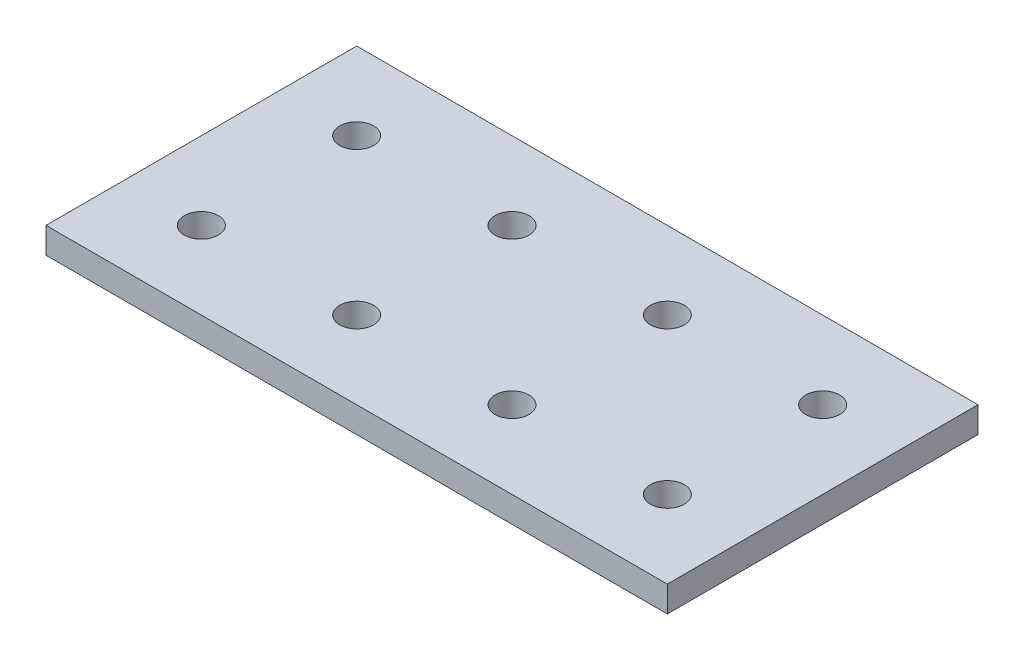
ISO-10303-21;
HEADER;
FILE_DESCRIPTION(('STEP AP214'),'2;1');
FILE_NAME('part.step','',(''),(''),'','','');
FILE_SCHEMA(('AUTOMOTIVE_DESIGN { 1 0 10303 214 1 1 1 1 }'));
ENDSEC;
DATA;
#1=APPLICATION_CONTEXT('core data for automotive mechanical design processes');
#2=APPLICATION_PROTOCOL_DEFINITION('international standard','automotive_design',2000,#1);
#3=PRODUCT_CONTEXT('',#1,'mechanical');
#4=PRODUCT('Part','Part','',(#3));
#5=PRODUCT_RELATED_PRODUCT_CATEGORY('part','',(#4));
#6=PRODUCT_DEFINITION_FORMATION('','',#4);
#7=PRODUCT_DEFINITION_CONTEXT('part definition',#1,'design');
#8=PRODUCT_DEFINITION('design','',#6,#7);
#9=PRODUCT_DEFINITION_SHAPE('','',#8);
#10=(LENGTH_UNIT() NAMED_UNIT(*) SI_UNIT(.MILLI.,.METRE.));
#11=(NAMED_UNIT(*) PLANE_ANGLE_UNIT() SI_UNIT($,.RADIAN.));
#12=(NAMED_UNIT(*) SI_UNIT($,.STERADIAN.) SOLID_ANGLE_UNIT());
#13=UNCERTAINTY_MEASURE_WITH_UNIT(LENGTH_MEASURE(1.E-05),#10,'distance_accuracy_value','');
#14=(GEOMETRIC_REPRESENTATION_CONTEXT(3) GLOBAL_UNCERTAINTY_ASSIGNED_CONTEXT((#13)) GLOBAL_UNIT_ASSIGNED_CONTEXT((#10,
#11,#12)) REPRESENTATION_CONTEXT('',''));
#15=CARTESIAN_POINT('',(0.,0.,0.));
#16=DIRECTION('',(0.,0.,1.));
#17=DIRECTION('',(1.,0.,0.));
#18=AXIS2_PLACEMENT_3D('',#15,#16,#17);
#19=CARTESIAN_POINT('',(133.35,6.35,-19.05));
#20=DIRECTION('',(0.,1.,0.));
#21=DIRECTION('',(0.,0.,1.));
#22=AXIS2_PLACEMENT_3D('',#19,#20,#21);
#23=CYLINDRICAL_SURFACE('',#22,4.167251);
#24=CARTESIAN_POINT('',(133.35,6.35,-19.05));
#25=DIRECTION('',(0.,1.,0.));
#26=DIRECTION('',(0.,0.,1.));
#27=AXIS2_PLACEMENT_3D('',#24,#25,#26);
#28=CIRCLE('',#27,4.167251);
#29=CARTESIAN_POINT('',(133.35,6.35,-14.882749));
#30=VERTEX_POINT('',#29);
#31=EDGE_CURVE('E47',#30,#30,#28,.T.);
#32=ORIENTED_EDGE('',*,*,#31,.T.);
#33=EDGE_LOOP('',(#32));
#34=FACE_BOUND('',#33,.T.);
#35=CARTESIAN_POINT('',(133.35,0.,-19.05));
#36=DIRECTION('',(0.,-1.,0.));
#37=DIRECTION('',(0.,0.,-1.));
#38=AXIS2_PLACEMENT_3D('',#35,#36,#37);
#39=CIRCLE('',#38,4.167251);
#40=CARTESIAN_POINT('',(133.35,0.,-23.217251));
#41=VERTEX_POINT('',#40);
#42=EDGE_CURVE('E11',#41,#41,#39,.T.);
#43=ORIENTED_EDGE('',*,*,#42,.T.);
#44=EDGE_LOOP('',(#43));
#45=FACE_BOUND('',#44,.T.);
#46=ADVANCED_FACE('F39',(#34,#45),#23,.F.);
#47=CARTESIAN_POINT('',(133.35,6.35,-57.15));
#48=DIRECTION('',(0.,1.,0.));
#49=DIRECTION('',(0.,0.,1.));
#50=AXIS2_PLACEMENT_3D('',#47,#48,#49);
#51=CYLINDRICAL_SURFACE('',#50,4.167251);
#52=CARTESIAN_POINT('',(133.35,6.35,-57.15));
#53=DIRECTION('',(0.,1.,0.));
#54=DIRECTION('',(0.,0.,1.));
#55=AXIS2_PLACEMENT_3D('',#52,#53,#54);
#56=CIRCLE('',#55,4.167251);
#57=CARTESIAN_POINT('',(133.35,6.35,-52.982749));
#58=VERTEX_POINT('',#57);
#59=EDGE_CURVE('E141',#58,#58,#56,.T.);
#60=ORIENTED_EDGE('',*,*,#59,.T.);
#61=EDGE_LOOP('',(#60));
#62=FACE_BOUND('',#61,.T.);
#63=CARTESIAN_POINT('',(133.35,0.,-57.15));
#64=DIRECTION('',(0.,-1.,0.));
#65=DIRECTION('',(0.,0.,-1.));
#66=AXIS2_PLACEMENT_3D('',#63,#64,#65);
#67=CIRCLE('',#66,4.167251);
#68=CARTESIAN_POINT('',(133.35,0.,-61.317251));
#69=VERTEX_POINT('',#68);
#70=EDGE_CURVE('E144',#69,#69,#67,.T.);
#71=ORIENTED_EDGE('',*,*,#70,.T.);
#72=EDGE_LOOP('',(#71));
#73=FACE_BOUND('',#72,.T.);
#74=ADVANCED_FACE('F169',(#62,#73),#51,.F.);
#75=CARTESIAN_POINT('',(95.25,6.35,-19.05));
#76=DIRECTION('',(0.,1.,0.));
#77=DIRECTION('',(0.,0.,1.));
#78=AXIS2_PLACEMENT_3D('',#75,#76,#77);
#79=CYLINDRICAL_SURFACE('',#78,4.167251);
#80=CARTESIAN_POINT('',(95.25,6.35,-19.05));
#81=DIRECTION('',(0.,1.,0.));
#82=DIRECTION('',(0.,0.,1.));
#83=AXIS2_PLACEMENT_3D('',#80,#81,#82);
#84=CIRCLE('',#83,4.167251);
#85=CARTESIAN_POINT('',(95.25,6.35,-14.882749));
#86=VERTEX_POINT('',#85);
#87=EDGE_CURVE('E135',#86,#86,#84,.T.);
#88=ORIENTED_EDGE('',*,*,#87,.T.);
#89=EDGE_LOOP('',(#88));
#90=FACE_BOUND('',#89,.T.);
#91=CARTESIAN_POINT('',(95.25,0.,-19.05));
#92=DIRECTION('',(0.,-1.,0.));
#93=DIRECTION('',(0.,0.,-1.));
#94=AXIS2_PLACEMENT_3D('',#91,#92,#93);
#95=CIRCLE('',#94,4.167251);
#96=CARTESIAN_POINT('',(95.25,0.,-23.217251));
#97=VERTEX_POINT('',#96);
#98=EDGE_CURVE('E138',#97,#97,#95,.T.);
#99=ORIENTED_EDGE('',*,*,#98,.T.);
#100=EDGE_LOOP('',(#99));
#101=FACE_BOUND('',#100,.T.);
#102=ADVANCED_FACE('F174',(#90,#101),#79,.F.);
#103=CARTESIAN_POINT('',(95.25,6.35,-57.15));
#104=DIRECTION('',(0.,1.,0.));
#105=DIRECTION('',(0.,0.,1.));
#106=AXIS2_PLACEMENT_3D('',#103,#104,#105);
#107=CYLINDRICAL_SURFACE('',#106,4.167251);
#108=CARTESIAN_POINT('',(95.25,6.35,-57.15));
#109=DIRECTION('',(0.,1.,0.));
#110=DIRECTION('',(0.,0.,1.));
#111=AXIS2_PLACEMENT_3D('',#108,#109,#110);
#112=CIRCLE('',#111,4.167251);
#113=CARTESIAN_POINT('',(95.25,6.35,-52.982749));
#114=VERTEX_POINT('',#113);
#115=EDGE_CURVE('E129',#114,#114,#112,.T.);
#116=ORIENTED_EDGE('',*,*,#115,.T.);
#117=EDGE_LOOP('',(#116));
#118=FACE_BOUND('',#117,.T.);
#119=CARTESIAN_POINT('',(95.25,0.,-57.15));
#120=DIRECTION('',(0.,-1.,0.));
#121=DIRECTION('',(0.,0.,-1.));
#122=AXIS2_PLACEMENT_3D('',#119,#120,#121);
#123=CIRCLE('',#122,4.167251);
#124=CARTESIAN_POINT('',(95.25,0.,-61.317251));
#125=VERTEX_POINT('',#124);
#126=EDGE_CURVE('E132',#125,#125,#123,.T.);
#127=ORIENTED_EDGE('',*,*,#126,.T.);
#128=EDGE_LOOP('',(#127));
#129=FACE_BOUND('',#128,.T.);
#130=ADVANCED_FACE('F179',(#118,#129),#107,.F.);
#131=CARTESIAN_POINT('',(57.15,6.35,-19.05));
#132=DIRECTION('',(0.,1.,0.));
#133=DIRECTION('',(0.,0.,1.));
#134=AXIS2_PLACEMENT_3D('',#131,#132,#133);
#135=CYLINDRICAL_SURFACE('',#134,4.167251);
#136=CARTESIAN_POINT('',(57.15,6.35,-19.05));
#137=DIRECTION('',(0.,1.,0.));
#138=DIRECTION('',(0.,0.,1.));
#139=AXIS2_PLACEMENT_3D('',#136,#137,#138);
#140=CIRCLE('',#139,4.167251);
#141=CARTESIAN_POINT('',(57.15,6.35,-14.882749));
#142=VERTEX_POINT('',#141);
#143=EDGE_CURVE('E123',#142,#142,#140,.T.);
#144=ORIENTED_EDGE('',*,*,#143,.T.);
#145=EDGE_LOOP('',(#144));
#146=FACE_BOUND('',#145,.T.);
#147=CARTESIAN_POINT('',(57.15,0.,-19.05));
#148=DIRECTION('',(0.,-1.,0.));
#149=DIRECTION('',(0.,0.,-1.));
#150=AXIS2_PLACEMENT_3D('',#147,#148,#149);
#151=CIRCLE('',#150,4.167251);
#152=CARTESIAN_POINT('',(57.15,0.,-23.217251));
#153=VERTEX_POINT('',#152);
#154=EDGE_CURVE('E126',#153,#153,#151,.T.);
#155=ORIENTED_EDGE('',*,*,#154,.T.);
#156=EDGE_LOOP('',(#155));
#157=FACE_BOUND('',#156,.T.);
#158=ADVANCED_FACE('F186',(#146,#157),#135,.F.);
#159=CARTESIAN_POINT('',(57.15,6.35,-57.15));
#160=DIRECTION('',(0.,1.,0.));
#161=DIRECTION('',(0.,0.,1.));
#162=AXIS2_PLACEMENT_3D('',#159,#160,#161);
#163=CYLINDRICAL_SURFACE('',#162,4.167251);
#164=CARTESIAN_POINT('',(57.15,6.35,-57.15));
#165=DIRECTION('',(0.,1.,0.));
#166=DIRECTION('',(0.,0.,1.));
#167=AXIS2_PLACEMENT_3D('',#164,#165,#166);
#168=CIRCLE('',#167,4.167251);
#169=CARTESIAN_POINT('',(57.15,6.35,-52.982749));
#170=VERTEX_POINT('',#169);
#171=EDGE_CURVE('E117',#170,#170,#168,.T.);
#172=ORIENTED_EDGE('',*,*,#171,.T.);
#173=EDGE_LOOP('',(#172));
#174=FACE_BOUND('',#173,.T.);
#175=CARTESIAN_POINT('',(57.15,0.,-57.15));
#176=DIRECTION('',(0.,-1.,0.));
#177=DIRECTION('',(0.,0.,-1.));
#178=AXIS2_PLACEMENT_3D('',#175,#176,#177);
#179=CIRCLE('',#178,4.167251);
#180=CARTESIAN_POINT('',(57.15,0.,-61.317251));
#181=VERTEX_POINT('',#180);
#182=EDGE_CURVE('E120',#181,#181,#179,.T.);
#183=ORIENTED_EDGE('',*,*,#182,.T.);
#184=EDGE_LOOP('',(#183));
#185=FACE_BOUND('',#184,.T.);
#186=ADVANCED_FACE('F190',(#174,#185),#163,.F.);
#187=CARTESIAN_POINT('',(0.,6.35,0.));
#188=DIRECTION('',(1.,0.,0.));
#189=DIRECTION('',(0.,0.,-1.));
#190=AXIS2_PLACEMENT_3D('',#187,#188,#189);
#191=PLANE('',#190);
#192=DIRECTION('',(0.,0.,1.));
#193=VECTOR('',#192,1.);
#194=CARTESIAN_POINT('',(0.,0.,0.));
#195=LINE('',#194,#193);
#196=CARTESIAN_POINT('',(0.,0.,-76.2));
#197=VERTEX_POINT('',#196);
#198=CARTESIAN_POINT('',(0.,0.,0.));
#199=VERTEX_POINT('',#198);
#200=EDGE_CURVE('E107',#197,#199,#195,.T.);
#201=ORIENTED_EDGE('',*,*,#200,.T.);
#202=DIRECTION('',(0.,-1.,0.));
#203=VECTOR('',#202,1.);
#204=CARTESIAN_POINT('',(0.,6.35,0.));
#205=LINE('',#204,#203);
#206=CARTESIAN_POINT('',(0.,6.35,0.));
#207=VERTEX_POINT('',#206);
#208=EDGE_CURVE('E98',#207,#199,#205,.T.);
#209=ORIENTED_EDGE('',*,*,#208,.F.);
#210=DIRECTION('',(0.,0.,1.));
#211=VECTOR('',#210,1.);
#212=CARTESIAN_POINT('',(0.,6.35,0.));
#213=LINE('',#212,#211);
#214=CARTESIAN_POINT('',(0.,6.35,-76.2));
#215=VERTEX_POINT('',#214);
#216=EDGE_CURVE('E92',#215,#207,#213,.T.);
#217=ORIENTED_EDGE('',*,*,#216,.F.);
#218=DIRECTION('',(0.,-1.,0.));
#219=VECTOR('',#218,1.);
#220=CARTESIAN_POINT('',(0.,6.35,-76.2));
#221=LINE('',#220,#219);
#222=EDGE_CURVE('E103',#215,#197,#221,.T.);
#223=ORIENTED_EDGE('',*,*,#222,.T.);
#224=EDGE_LOOP('',(#201,#209,#217,#223));
#225=FACE_BOUND('',#224,.T.);
#226=ADVANCED_FACE('F193',(#225),#191,.F.);
#227=CARTESIAN_POINT('',(0.,6.35,0.));
#228=DIRECTION('',(0.,0.,-1.));
#229=DIRECTION('',(-1.,0.,0.));
#230=AXIS2_PLACEMENT_3D('',#227,#228,#229);
#231=PLANE('',#230);
#232=DIRECTION('',(1.,0.,0.));
#233=VECTOR('',#232,1.);
#234=CARTESIAN_POINT('',(0.,0.,0.));
#235=LINE('',#234,#233);
#236=CARTESIAN_POINT('',(152.4,0.,0.));
#237=VERTEX_POINT('',#236);
#238=EDGE_CURVE('E97',#199,#237,#235,.T.);
#239=ORIENTED_EDGE('',*,*,#238,.T.);
#240=DIRECTION('',(0.,-1.,0.));
#241=VECTOR('',#240,1.);
#242=CARTESIAN_POINT('',(152.4,6.35,0.));
#243=LINE('',#242,#241);
#244=CARTESIAN_POINT('',(152.4,6.35,0.));
#245=VERTEX_POINT('',#244);
#246=EDGE_CURVE('E95',#245,#237,#243,.T.);
#247=ORIENTED_EDGE('',*,*,#246,.F.);
#248=DIRECTION('',(1.,0.,0.));
#249=VECTOR('',#248,1.);
#250=CARTESIAN_POINT('',(0.,6.35,0.));
#251=LINE('',#250,#249);
#252=EDGE_CURVE('E86',#207,#245,#251,.T.);
#253=ORIENTED_EDGE('',*,*,#252,.F.);
#254=ORIENTED_EDGE('',*,*,#208,.T.);
#255=EDGE_LOOP('',(#239,#247,#253,#254));
#256=FACE_BOUND('',#255,.T.);
#257=ADVANCED_FACE('F96',(#256),#231,.F.);
#258=CARTESIAN_POINT('',(152.4,6.35,0.));
#259=DIRECTION('',(-1.,0.,0.));
#260=DIRECTION('',(0.,0.,1.));
#261=AXIS2_PLACEMENT_3D('',#258,#259,#260);
#262=PLANE('',#261);
#263=DIRECTION('',(0.,0.,-1.));
#264=VECTOR('',#263,1.);
#265=CARTESIAN_POINT('',(152.4,0.,0.));
#266=LINE('',#265,#264);
#267=CARTESIAN_POINT('',(152.4,0.,-76.2));
#268=VERTEX_POINT('',#267);
#269=EDGE_CURVE('E72',#237,#268,#266,.T.);
#270=ORIENTED_EDGE('',*,*,#269,.T.);
#271=DIRECTION('',(0.,-1.,0.));
#272=VECTOR('',#271,1.);
#273=CARTESIAN_POINT('',(152.4,6.35,-76.2));
#274=LINE('',#273,#272);
#275=CARTESIAN_POINT('',(152.4,6.35,-76.2));
#276=VERTEX_POINT('',#275);
#277=EDGE_CURVE('E99',#276,#268,#274,.T.);
#278=ORIENTED_EDGE('',*,*,#277,.F.);
#279=DIRECTION('',(0.,0.,-1.));
#280=VECTOR('',#279,1.);
#281=CARTESIAN_POINT('',(152.4,6.35,0.));
#282=LINE('',#281,#280);
#283=EDGE_CURVE('E90',#245,#276,#282,.T.);
#284=ORIENTED_EDGE('',*,*,#283,.F.);
#285=ORIENTED_EDGE('',*,*,#246,.T.);
#286=EDGE_LOOP('',(#270,#278,#284,#285));
#287=FACE_BOUND('',#286,.T.);
#288=ADVANCED_FACE('F101',(#287),#262,.F.);
#289=CARTESIAN_POINT('',(0.,6.35,-76.2));
#290=DIRECTION('',(0.,0.,1.));
#291=DIRECTION('',(1.,0.,0.));
#292=AXIS2_PLACEMENT_3D('',#289,#290,#291);
#293=PLANE('',#292);
#294=DIRECTION('',(-1.,0.,0.));
#295=VECTOR('',#294,1.);
#296=CARTESIAN_POINT('',(0.,0.,-76.2));
#297=LINE('',#296,#295);
#298=EDGE_CURVE('E78',#268,#197,#297,.T.);
#299=ORIENTED_EDGE('',*,*,#298,.T.);
#300=ORIENTED_EDGE('',*,*,#222,.F.);
#301=DIRECTION('',(-1.,0.,0.));
#302=VECTOR('',#301,1.);
#303=CARTESIAN_POINT('',(0.,6.35,-76.2));
#304=LINE('',#303,#302);
#305=EDGE_CURVE('E55',#276,#215,#304,.T.);
#306=ORIENTED_EDGE('',*,*,#305,.F.);
#307=ORIENTED_EDGE('',*,*,#277,.T.);
#308=EDGE_LOOP('',(#299,#300,#306,#307));
#309=FACE_BOUND('',#308,.T.);
#310=ADVANCED_FACE('F153',(#309),#293,.F.);
#311=CARTESIAN_POINT('',(0.,6.35,0.));
#312=DIRECTION('',(0.,-1.,0.));
#313=DIRECTION('',(0.,0.,-1.));
#314=AXIS2_PLACEMENT_3D('',#311,#312,#313);
#315=PLANE('',#314);
#316=CARTESIAN_POINT('',(19.05,6.35,-19.05));
#317=DIRECTION('',(0.,1.,0.));
#318=DIRECTION('',(0.,0.,1.));
#319=AXIS2_PLACEMENT_3D('',#316,#317,#318);
#320=CIRCLE('',#319,4.167251);
#321=CARTESIAN_POINT('',(19.05,6.35,-14.882749));
#322=VERTEX_POINT('',#321);
#323=EDGE_CURVE('E250',#322,#322,#320,.T.);
#324=ORIENTED_EDGE('',*,*,#323,.F.);
#325=EDGE_LOOP('',(#324));
#326=FACE_BOUND('',#325,.T.);
#327=CARTESIAN_POINT('',(19.05,6.35,-57.15));
#328=DIRECTION('',(0.,1.,0.));
#329=DIRECTION('',(0.,0.,1.));
#330=AXIS2_PLACEMENT_3D('',#327,#328,#329);
#331=CIRCLE('',#330,4.167251);
#332=CARTESIAN_POINT('',(19.05,6.35,-52.982749));
#333=VERTEX_POINT('',#332);
#334=EDGE_CURVE('E254',#333,#333,#331,.T.);
#335=ORIENTED_EDGE('',*,*,#334,.F.);
#336=EDGE_LOOP('',(#335));
#337=FACE_BOUND('',#336,.T.);
#338=ORIENTED_EDGE('',*,*,#216,.T.);
#339=ORIENTED_EDGE('',*,*,#252,.T.);
#340=ORIENTED_EDGE('',*,*,#283,.T.);
#341=ORIENTED_EDGE('',*,*,#305,.T.);
#342=EDGE_LOOP('',(#338,#339,#340,#341));
#343=FACE_BOUND('',#342,.T.);
#344=ORIENTED_EDGE('',*,*,#171,.F.);
#345=EDGE_LOOP('',(#344));
#346=FACE_BOUND('',#345,.T.);
#347=ORIENTED_EDGE('',*,*,#143,.F.);
#348=EDGE_LOOP('',(#347));
#349=FACE_BOUND('',#348,.T.);
#350=ORIENTED_EDGE('',*,*,#115,.F.);
#351=EDGE_LOOP('',(#350));
#352=FACE_BOUND('',#351,.T.);
#353=ORIENTED_EDGE('',*,*,#87,.F.);
#354=EDGE_LOOP('',(#353));
#355=FACE_BOUND('',#354,.T.);
#356=ORIENTED_EDGE('',*,*,#59,.F.);
#357=EDGE_LOOP('',(#356));
#358=FACE_BOUND('',#357,.T.);
#359=ORIENTED_EDGE('',*,*,#31,.F.);
#360=EDGE_LOOP('',(#359));
#361=FACE_BOUND('',#360,.T.);
#362=ADVANCED_FACE('F87',(#326,#337,#343,#346,#349,#352,#355,#358,#361),#315,.F.);
#363=CARTESIAN_POINT('',(0.,0.,0.));
#364=DIRECTION('',(0.,-1.,0.));
#365=DIRECTION('',(0.,0.,-1.));
#366=AXIS2_PLACEMENT_3D('',#363,#364,#365);
#367=PLANE('',#366);
#368=CARTESIAN_POINT('',(19.05,0.,-19.05));
#369=DIRECTION('',(0.,-1.,0.));
#370=DIRECTION('',(0.,0.,-1.));
#371=AXIS2_PLACEMENT_3D('',#368,#369,#370);
#372=CIRCLE('',#371,4.167251);
#373=CARTESIAN_POINT('',(19.05,0.,-23.217251));
#374=VERTEX_POINT('',#373);
#375=EDGE_CURVE('E253',#374,#374,#372,.T.);
#376=ORIENTED_EDGE('',*,*,#375,.F.);
#377=EDGE_LOOP('',(#376));
#378=FACE_BOUND('',#377,.T.);
#379=CARTESIAN_POINT('',(19.05,0.,-57.15));
#380=DIRECTION('',(0.,-1.,0.));
#381=DIRECTION('',(0.,0.,-1.));
#382=AXIS2_PLACEMENT_3D('',#379,#380,#381);
#383=CIRCLE('',#382,4.167251);
#384=CARTESIAN_POINT('',(19.05,0.,-61.317251));
#385=VERTEX_POINT('',#384);
#386=EDGE_CURVE('E110',#385,#385,#383,.T.);
#387=ORIENTED_EDGE('',*,*,#386,.F.);
#388=EDGE_LOOP('',(#387));
#389=FACE_BOUND('',#388,.T.);
#390=ORIENTED_EDGE('',*,*,#200,.F.);
#391=ORIENTED_EDGE('',*,*,#298,.F.);
#392=ORIENTED_EDGE('',*,*,#269,.F.);
#393=ORIENTED_EDGE('',*,*,#238,.F.);
#394=EDGE_LOOP('',(#390,#391,#392,#393));
#395=FACE_BOUND('',#394,.T.);
#396=ORIENTED_EDGE('',*,*,#182,.F.);
#397=EDGE_LOOP('',(#396));
#398=FACE_BOUND('',#397,.T.);
#399=ORIENTED_EDGE('',*,*,#154,.F.);
#400=EDGE_LOOP('',(#399));
#401=FACE_BOUND('',#400,.T.);
#402=ORIENTED_EDGE('',*,*,#126,.F.);
#403=EDGE_LOOP('',(#402));
#404=FACE_BOUND('',#403,.T.);
#405=ORIENTED_EDGE('',*,*,#98,.F.);
#406=EDGE_LOOP('',(#405));
#407=FACE_BOUND('',#406,.T.);
#408=ORIENTED_EDGE('',*,*,#70,.F.);
#409=EDGE_LOOP('',(#408));
#410=FACE_BOUND('',#409,.T.);
#411=ORIENTED_EDGE('',*,*,#42,.F.);
#412=EDGE_LOOP('',(#411));
#413=FACE_BOUND('',#412,.T.);
#414=ADVANCED_FACE('F152',(#378,#389,#395,#398,#401,#404,#407,#410,#413),#367,.T.);
#415=CARTESIAN_POINT('',(19.05,6.35,-57.15));
#416=DIRECTION('',(0.,1.,0.));
#417=DIRECTION('',(0.,0.,1.));
#418=AXIS2_PLACEMENT_3D('',#415,#416,#417);
#419=CYLINDRICAL_SURFACE('',#418,4.167251);
#420=ORIENTED_EDGE('',*,*,#334,.T.);
#421=EDGE_LOOP('',(#420));
#422=FACE_BOUND('',#421,.T.);
#423=ORIENTED_EDGE('',*,*,#386,.T.);
#424=EDGE_LOOP('',(#423));
#425=FACE_BOUND('',#424,.T.);
#426=ADVANCED_FACE('F160',(#422,#425),#419,.F.);
#427=CARTESIAN_POINT('',(19.05,6.35,-19.05));
#428=DIRECTION('',(0.,1.,0.));
#429=DIRECTION('',(0.,0.,1.));
#430=AXIS2_PLACEMENT_3D('',#427,#428,#429);
#431=CYLINDRICAL_SURFACE('',#430,4.167251);
#432=ORIENTED_EDGE('',*,*,#323,.T.);
#433=EDGE_LOOP('',(#432));
#434=FACE_BOUND('',#433,.T.);
#435=ORIENTED_EDGE('',*,*,#375,.T.);
#436=EDGE_LOOP('',(#435));
#437=FACE_BOUND('',#436,.T.);
#438=ADVANCED_FACE('F213',(#434,#437),#431,.F.);
#439=CLOSED_SHELL('',(#46,#74,#102,#130,#158,#186,#226,#257,#288,#310,#362,#414,#426,#438));
#440=MANIFOLD_SOLID_BREP('B2',#439);
#441=ADVANCED_BREP_SHAPE_REPRESENTATION('',(#18,#440),#14);
#442=SHAPE_DEFINITION_REPRESENTATION(#9,#441);
ENDSEC;
END-ISO-10303-21;
